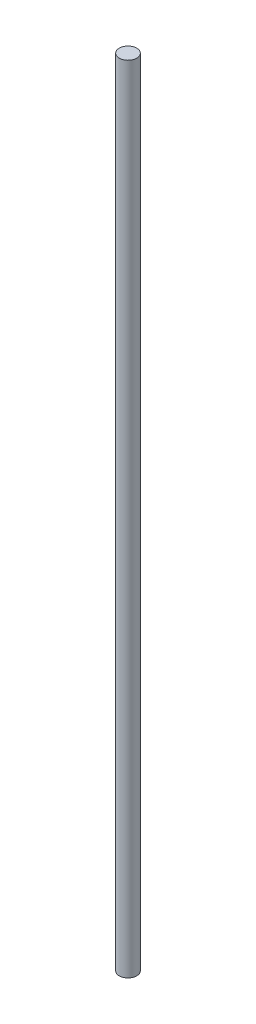
ISO-10303-21;
HEADER;
FILE_DESCRIPTION(('STEP AP214'),'2;1');
FILE_NAME('part.step','',(''),(''),'','','');
FILE_SCHEMA(('AUTOMOTIVE_DESIGN { 1 0 10303 214 1 1 1 1 }'));
ENDSEC;
DATA;
#1=APPLICATION_CONTEXT('core data for automotive mechanical design processes');
#2=APPLICATION_PROTOCOL_DEFINITION('international standard','automotive_design',2000,#1);
#3=PRODUCT_CONTEXT('',#1,'mechanical');
#4=PRODUCT('Part','Part','',(#3));
#5=PRODUCT_RELATED_PRODUCT_CATEGORY('part','',(#4));
#6=PRODUCT_DEFINITION_FORMATION('','',#4);
#7=PRODUCT_DEFINITION_CONTEXT('part definition',#1,'design');
#8=PRODUCT_DEFINITION('design','',#6,#7);
#9=PRODUCT_DEFINITION_SHAPE('','',#8);
#10=(LENGTH_UNIT() NAMED_UNIT(*) SI_UNIT(.MILLI.,.METRE.));
#11=(NAMED_UNIT(*) PLANE_ANGLE_UNIT() SI_UNIT($,.RADIAN.));
#12=(NAMED_UNIT(*) SI_UNIT($,.STERADIAN.) SOLID_ANGLE_UNIT());
#13=UNCERTAINTY_MEASURE_WITH_UNIT(LENGTH_MEASURE(1.E-05),#10,'distance_accuracy_value','');
#14=(GEOMETRIC_REPRESENTATION_CONTEXT(3) GLOBAL_UNCERTAINTY_ASSIGNED_CONTEXT((#13)) GLOBAL_UNIT_ASSIGNED_CONTEXT((#10,
#11,#12)) REPRESENTATION_CONTEXT('',''));
#15=CARTESIAN_POINT('',(0.,0.,0.));
#16=DIRECTION('',(0.,0.,1.));
#17=DIRECTION('',(1.,0.,0.));
#18=AXIS2_PLACEMENT_3D('',#15,#16,#17);
#19=CARTESIAN_POINT('',(0.,288.925,0.));
#20=DIRECTION('',(0.,-1.,0.));
#21=DIRECTION('',(0.,0.,-1.));
#22=AXIS2_PLACEMENT_3D('',#19,#20,#21);
#23=CYLINDRICAL_SURFACE('',#22,3.175);
#24=CARTESIAN_POINT('',(0.,288.925,0.));
#25=DIRECTION('',(0.,1.,0.));
#26=DIRECTION('',(0.,0.,1.));
#27=AXIS2_PLACEMENT_3D('',#24,#25,#26);
#28=CIRCLE('',#27,3.175);
#29=CARTESIAN_POINT('',(0.,288.925,3.175));
#30=VERTEX_POINT('',#29);
#31=EDGE_CURVE('E10',#30,#30,#28,.T.);
#32=ORIENTED_EDGE('',*,*,#31,.F.);
#33=EDGE_LOOP('',(#32));
#34=FACE_BOUND('',#33,.T.);
#35=CARTESIAN_POINT('',(0.,0.,0.));
#36=DIRECTION('',(0.,1.,0.));
#37=DIRECTION('',(0.,0.,1.));
#38=AXIS2_PLACEMENT_3D('',#35,#36,#37);
#39=CIRCLE('',#38,3.175);
#40=CARTESIAN_POINT('',(0.,0.,3.175));
#41=VERTEX_POINT('',#40);
#42=EDGE_CURVE('E34',#41,#41,#39,.T.);
#43=ORIENTED_EDGE('',*,*,#42,.T.);
#44=EDGE_LOOP('',(#43));
#45=FACE_BOUND('',#44,.T.);
#46=ADVANCED_FACE('F31',(#34,#45),#23,.T.);
#47=CARTESIAN_POINT('',(0.,288.925,0.));
#48=DIRECTION('',(0.,1.,0.));
#49=DIRECTION('',(0.,0.,1.));
#50=AXIS2_PLACEMENT_3D('',#47,#48,#49);
#51=PLANE('',#50);
#52=ORIENTED_EDGE('',*,*,#31,.T.);
#53=EDGE_LOOP('',(#52));
#54=FACE_BOUND('',#53,.T.);
#55=ADVANCED_FACE('F46',(#54),#51,.T.);
#56=CARTESIAN_POINT('',(0.,0.,0.));
#57=DIRECTION('',(0.,1.,0.));
#58=DIRECTION('',(0.,0.,1.));
#59=AXIS2_PLACEMENT_3D('',#56,#57,#58);
#60=PLANE('',#59);
#61=ORIENTED_EDGE('',*,*,#42,.F.);
#62=EDGE_LOOP('',(#61));
#63=FACE_BOUND('',#62,.T.);
#64=ADVANCED_FACE('F44',(#63),#60,.F.);
#65=CLOSED_SHELL('',(#46,#55,#64));
#66=MANIFOLD_SOLID_BREP('B2',#65);
#67=ADVANCED_BREP_SHAPE_REPRESENTATION('',(#18,#66),#14);
#68=SHAPE_DEFINITION_REPRESENTATION(#9,#67);
ENDSEC;
END-ISO-10303-21;
